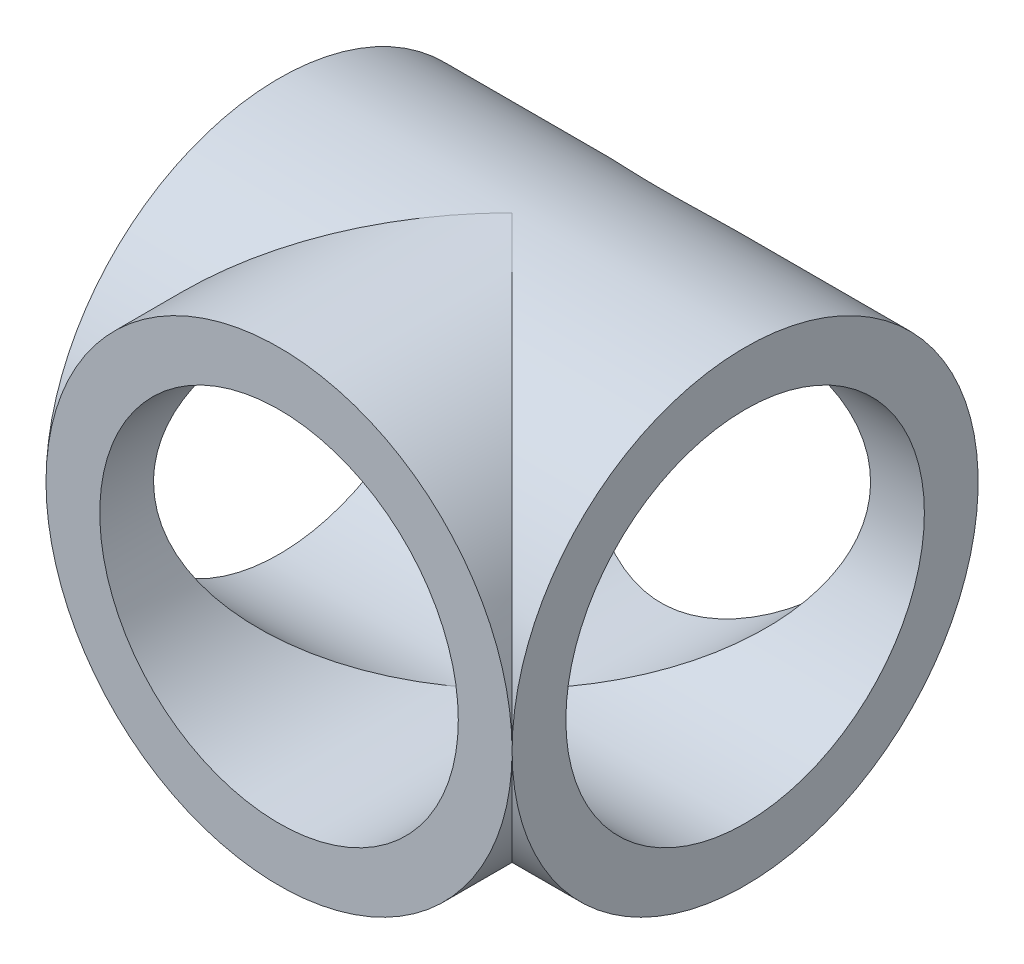
ISO-10303-21;
HEADER;
FILE_DESCRIPTION(('STEP AP214'),'2;1');
FILE_NAME('part.step','',(''),(''),'','','');
FILE_SCHEMA(('AUTOMOTIVE_DESIGN { 1 0 10303 214 1 1 1 1 }'));
ENDSEC;
DATA;
#1=APPLICATION_CONTEXT('core data for automotive mechanical design processes');
#2=APPLICATION_PROTOCOL_DEFINITION('international standard','automotive_design',2000,#1);
#3=PRODUCT_CONTEXT('',#1,'mechanical');
#4=PRODUCT('Part','Part','',(#3));
#5=PRODUCT_RELATED_PRODUCT_CATEGORY('part','',(#4));
#6=PRODUCT_DEFINITION_FORMATION('','',#4);
#7=PRODUCT_DEFINITION_CONTEXT('part definition',#1,'design');
#8=PRODUCT_DEFINITION('design','',#6,#7);
#9=PRODUCT_DEFINITION_SHAPE('','',#8);
#10=(LENGTH_UNIT() NAMED_UNIT(*) SI_UNIT(.MILLI.,.METRE.));
#11=(NAMED_UNIT(*) PLANE_ANGLE_UNIT() SI_UNIT($,.RADIAN.));
#12=(NAMED_UNIT(*) SI_UNIT($,.STERADIAN.) SOLID_ANGLE_UNIT());
#13=UNCERTAINTY_MEASURE_WITH_UNIT(LENGTH_MEASURE(1.E-05),#10,'distance_accuracy_value','');
#14=(GEOMETRIC_REPRESENTATION_CONTEXT(3) GLOBAL_UNCERTAINTY_ASSIGNED_CONTEXT((#13)) GLOBAL_UNIT_ASSIGNED_CONTEXT((#10,
#11,#12)) REPRESENTATION_CONTEXT('',''));
#15=CARTESIAN_POINT('',(0.,0.,0.));
#16=DIRECTION('',(0.,0.,1.));
#17=DIRECTION('',(1.,0.,0.));
#18=AXIS2_PLACEMENT_3D('',#15,#16,#17);
#19=CARTESIAN_POINT('',(0.,0.,-20.));
#20=DIRECTION('',(0.,0.,1.));
#21=DIRECTION('',(1.,0.,0.));
#22=AXIS2_PLACEMENT_3D('',#19,#20,#21);
#23=CYLINDRICAL_SURFACE('',#22,10.);
#24=CARTESIAN_POINT('',(0.,0.,13.));
#25=DIRECTION('',(0.,0.,1.));
#26=DIRECTION('',(1.,0.,0.));
#27=AXIS2_PLACEMENT_3D('',#24,#25,#26);
#28=CIRCLE('',#27,10.);
#29=CARTESIAN_POINT('',(10.,0.,13.));
#30=VERTEX_POINT('',#29);
#31=EDGE_CURVE('E121',#30,#30,#28,.T.);
#32=ORIENTED_EDGE('',*,*,#31,.T.);
#33=EDGE_LOOP('',(#32));
#34=FACE_BOUND('',#33,.T.);
#35=CARTESIAN_POINT('',(0.,0.,0.));
#36=DIRECTION('',(0.707106781186547,0.,0.707106781186547));
#37=DIRECTION('',(-0.707106781186547,0.,0.707106781186547));
#38=AXIS2_PLACEMENT_3D('',#35,#36,#37);
#39=ELLIPSE('',#38,14.1421356237309,10.);
#40=CARTESIAN_POINT('',(0.,-10.,0.));
#41=VERTEX_POINT('',#40);
#42=CARTESIAN_POINT('',(0.,10.,0.));
#43=VERTEX_POINT('',#42);
#44=EDGE_CURVE('E54',#41,#43,#39,.F.);
#45=ORIENTED_EDGE('',*,*,#44,.T.);
#46=CARTESIAN_POINT('',(0.,0.,0.));
#47=DIRECTION('',(-0.707106781186547,0.,0.707106781186547));
#48=DIRECTION('',(0.707106781186547,0.,0.707106781186547));
#49=AXIS2_PLACEMENT_3D('',#46,#47,#48);
#50=ELLIPSE('',#49,14.1421356237309,10.);
#51=EDGE_CURVE('E11',#43,#41,#50,.F.);
#52=ORIENTED_EDGE('',*,*,#51,.T.);
#53=EDGE_LOOP('',(#45,#52));
#54=FACE_BOUND('',#53,.T.);
#55=ADVANCED_FACE('F39',(#34,#54),#23,.F.);
#56=CARTESIAN_POINT('',(-13.,0.,0.));
#57=DIRECTION('',(1.,0.,0.));
#58=DIRECTION('',(0.,0.,-1.));
#59=AXIS2_PLACEMENT_3D('',#56,#57,#58);
#60=CYLINDRICAL_SURFACE('',#59,13.);
#61=CARTESIAN_POINT('',(-10.,0.,-13.));
#62=CARTESIAN_POINT('',(-10.0000015936708,0.242807032138664,-13.0000015508397));
#63=CARTESIAN_POINT('',(-9.99114466176018,0.48559485000438,-12.9931846000855));
#64=CARTESIAN_POINT('',(-9.95587278049876,0.969223062587691,-12.9660816615135));
#65=CARTESIAN_POINT('',(-9.92945165614769,1.21006274225187,-12.9457909367568));
#66=CARTESIAN_POINT('',(-9.85945280094943,1.68808503221816,-12.8921799513601));
#67=CARTESIAN_POINT('',(-9.81585190164868,1.92526225263056,-12.8588420959167));
#68=CARTESIAN_POINT('',(-9.71220619186371,2.39387505659068,-12.7798991544544));
#69=CARTESIAN_POINT('',(-9.65216255209941,2.62531104763386,-12.7342949418019));
#70=CARTESIAN_POINT('',(-9.5169161703633,3.07963617362338,-12.6320918522629));
#71=CARTESIAN_POINT('',(-9.44180514331292,3.30256774690942,-12.5755595666376));
#72=CARTESIAN_POINT('',(-9.27717128501848,3.7401534229174,-12.4524263396324));
#73=CARTESIAN_POINT('',(-9.18764823451349,3.95480739964445,-12.385825245069));
#74=CARTESIAN_POINT('',(-8.99522033964302,4.3748558839517,-12.2437648775377));
#75=CARTESIAN_POINT('',(-8.89232067713747,4.58025393583328,-12.1683090358357));
#76=CARTESIAN_POINT('',(-8.67403389583575,4.98129337775095,-12.009714311468));
#77=CARTESIAN_POINT('',(-8.55864212335768,5.17693109184884,-11.9265725672721));
#78=CARTESIAN_POINT('',(-8.30496045482638,5.57571292090348,-11.7457958769228));
#79=CARTESIAN_POINT('',(-8.16553849802746,5.77785141030143,-11.6475325600616));
#80=CARTESIAN_POINT('',(-7.87385887646458,6.16943831864769,-11.4449395496011));
#81=CARTESIAN_POINT('',(-7.72159948538149,6.35888502469641,-11.3406090407008));
#82=CARTESIAN_POINT('',(-7.4048683475056,6.72507351489174,-11.1273688169516));
#83=CARTESIAN_POINT('',(-7.24037954081195,6.90179684752463,-11.018452800778));
#84=CARTESIAN_POINT('',(-6.90008419180774,7.24201046972777,-10.7978877395886));
#85=CARTESIAN_POINT('',(-6.72428062018934,7.40550420748832,-10.6862394166726));
#86=CARTESIAN_POINT('',(-6.32302708914024,7.75267471913366,-10.4379480570597));
#87=CARTESIAN_POINT('',(-6.09499376889194,7.93320304467126,-10.3010601681606));
#88=CARTESIAN_POINT('',(-5.62327116239582,8.27427260789736,-10.0291570710896));
#89=CARTESIAN_POINT('',(-5.37957701322961,8.43480759145202,-9.89414246057659));
#90=CARTESIAN_POINT('',(-4.87688279716864,8.73507977812582,-9.63007244778975));
#91=CARTESIAN_POINT('',(-4.61789558351795,8.87483410856925,-9.50101219915607));
#92=CARTESIAN_POINT('',(-4.08466204071591,9.13253912364104,-9.2535741549753));
#93=CARTESIAN_POINT('',(-3.81042456262883,9.25050228725785,-9.13519026548099));
#94=CARTESIAN_POINT('',(-3.1646441521692,9.49398709572563,-8.88274716970649));
#95=CARTESIAN_POINT('',(-2.7879064811507,9.61181901858345,-8.75406424027543));
#96=CARTESIAN_POINT('',(-2.2064176820189,9.75559210219195,-8.59265063451949));
#97=CARTESIAN_POINT('',(-2.00998036640735,9.79800509685261,-8.54413419743265));
#98=CARTESIAN_POINT('',(-1.61237836927584,9.87122257600602,-8.45943845030322));
#99=CARTESIAN_POINT('',(-1.41121625980722,9.90203322772709,-8.42325258691669));
#100=CARTESIAN_POINT('',(-1.00310660306036,9.95170823805676,-8.36450933572807));
#101=CARTESIAN_POINT('',(-0.796119575692899,9.97043574512663,-8.34210819837131));
#102=CARTESIAN_POINT('',(-0.380278611393944,9.99493646044255,-8.31273832620987));
#103=CARTESIAN_POINT('',(-0.171424758097213,10.0007102461305,-8.30576890350122));
#104=CARTESIAN_POINT('',(0.246178019587992,9.99915005215022,-8.3076470019975));
#105=CARTESIAN_POINT('',(0.454926933167803,9.99181492288274,-8.31649591040661));
#106=CARTESIAN_POINT('',(0.870330026174368,9.96422912377529,-8.34952659288942));
#107=CARTESIAN_POINT('',(1.07698420251023,9.94397843488054,-8.37370838958428));
#108=CARTESIAN_POINT('',(1.46077611302282,9.89437934343394,-8.43223083391789));
#109=CARTESIAN_POINT('',(1.63836215893885,9.86649238457407,-8.46491484418373));
#110=CARTESIAN_POINT('',(1.98983471837062,9.80165921740072,-8.53990249014137));
#111=CARTESIAN_POINT('',(2.16371989826362,9.76470980151033,-8.58220953143449));
#112=CARTESIAN_POINT('',(2.67905495836881,9.64092546187557,-8.72169630381142));
#113=CARTESIAN_POINT('',(3.01410873404257,9.54116452600475,-8.83142919974863));
#114=CARTESIAN_POINT('',(3.60817855511688,9.33073948619979,-9.05297946378067));
#115=CARTESIAN_POINT('',(3.87035235782311,9.2249118432684,-9.16118334144466));
#116=CARTESIAN_POINT('',(4.38114894756183,8.99356027077872,-9.3884062458422));
#117=CARTESIAN_POINT('',(4.62976412243357,8.86802542739885,-9.50743124983691));
#118=CARTESIAN_POINT('',(5.11375085679115,8.59805359213383,-9.75226978340447));
#119=CARTESIAN_POINT('',(5.34909294899211,8.4535767407365,-9.87809728980088));
#120=CARTESIAN_POINT('',(5.80590711636373,8.14660318454038,-10.1327504299295));
#121=CARTESIAN_POINT('',(6.02738151411002,7.98410950991666,-10.2615755566333));
#122=CARTESIAN_POINT('',(6.46327400097469,7.63586505952988,-10.5234297143361));
#123=CARTESIAN_POINT('',(6.67722343014561,7.44952688621407,-10.6564582461348));
#124=CARTESIAN_POINT('',(7.08950694010948,7.05830323794465,-10.9195206446139));
#125=CARTESIAN_POINT('',(7.28783944253884,6.85341589275996,-11.049554207663));
#126=CARTESIAN_POINT('',(7.66757098527356,6.42572937938231,-11.3036178485803));
#127=CARTESIAN_POINT('',(7.84899641994254,6.20295917658503,-11.4276571335013));
#128=CARTESIAN_POINT('',(8.19388188709714,5.73965593248316,-11.6672328720954));
#129=CARTESIAN_POINT('',(8.35734591341937,5.49912685994802,-11.7827712141133));
#130=CARTESIAN_POINT('',(8.63668064285031,5.04629346721088,-11.9826774715815));
#131=CARTESIAN_POINT('',(8.75580152484482,4.83680566231991,-12.0688938526394));
#132=CARTESIAN_POINT('',(8.97980355638798,4.40701997489678,-12.2323754063567));
#133=CARTESIAN_POINT('',(9.08468758194032,4.18672428795553,-12.3096423864307));
#134=CARTESIAN_POINT('',(9.27905407965338,3.73621659254942,-12.4537783751208));
#135=CARTESIAN_POINT('',(9.36854109597122,3.5060075350063,-12.5206504510458));
#136=CARTESIAN_POINT('',(9.53098147282556,3.03677831442462,-12.6426552405453));
#137=CARTESIAN_POINT('',(9.60393468191351,2.79775807069953,-12.6977878465867));
#138=CARTESIAN_POINT('',(9.73266267918379,2.31066689524092,-12.7954268857977));
#139=CARTESIAN_POINT('',(9.78830935378846,2.06254299060328,-12.8378390760887));
#140=CARTESIAN_POINT('',(9.88073791771212,1.56079517074882,-12.9084503763464));
#141=CARTESIAN_POINT('',(9.91751972641411,1.30717123203301,-12.9366494255748));
#142=CARTESIAN_POINT('',(9.97150949956756,0.796757596519581,-12.9780854483897));
#143=CARTESIAN_POINT('',(9.98872732558396,0.539969560685166,-12.9913299600491));
#144=CARTESIAN_POINT('',(10.0032768827642,0.0255105335601476,-13.0025199330903));
#145=CARTESIAN_POINT('',(10.0006106704895,-0.232160363662756,-13.0004669766549));
#146=CARTESIAN_POINT('',(9.97692220479573,-0.716031577612342,-12.9822545351876));
#147=CARTESIAN_POINT('',(9.95807124720882,-0.94240610722969,-12.9677637343962));
#148=CARTESIAN_POINT('',(9.90518951571755,-1.3923041243846,-12.9271996395152));
#149=CARTESIAN_POINT('',(9.87116013963562,-1.61582787250918,-12.901127411992));
#150=CARTESIAN_POINT('',(9.78841442983994,-2.05856020658568,-12.8379260332623));
#151=CARTESIAN_POINT('',(9.73969658924814,-2.27776834734368,-12.8007957476231));
#152=CARTESIAN_POINT('',(9.6282347664812,-2.71054148672981,-12.7161939847182));
#153=CARTESIAN_POINT('',(9.56549014748951,-2.92410622865492,-12.668722037943));
#154=CARTESIAN_POINT('',(9.42556955745235,-3.34802777701546,-12.5634072426999));
#155=CARTESIAN_POINT('',(9.34816851459013,-3.55827013187015,-12.5054033236095));
#156=CARTESIAN_POINT('',(9.18050336248252,-3.97089439697922,-12.3805702666688));
#157=CARTESIAN_POINT('',(9.09023469809512,-4.17327349121307,-12.3137380041991));
#158=CARTESIAN_POINT('',(8.80149941319451,-4.76731436996982,-12.1016220064741));
#159=CARTESIAN_POINT('',(8.58499896256089,-5.14619127582007,-11.9446392676165));
#160=CARTESIAN_POINT('',(8.07217991410438,-5.923736407294,-11.5811085980081));
#161=CARTESIAN_POINT('',(7.76862258126021,-6.31577096091044,-11.3706498133092));
#162=CARTESIAN_POINT('',(7.27682958572621,-6.86353830721924,-11.0425280951877));
#163=CARTESIAN_POINT('',(7.10658804567629,-7.03960702826518,-10.9309354603759));
#164=CARTESIAN_POINT('',(6.75451428855746,-7.37808495382674,-10.705380259583));
#165=CARTESIAN_POINT('',(6.57268455359917,-7.54049706632198,-10.591418204615));
#166=CARTESIAN_POINT('',(6.15911939067563,-7.88363053302019,-10.3393695004614));
#167=CARTESIAN_POINT('',(5.92483551980561,-8.06120044507073,-10.2011638654771));
#168=CARTESIAN_POINT('',(5.44032676524378,-8.39580676350278,-9.92759451060697));
#169=CARTESIAN_POINT('',(5.19009647019613,-8.55283614375974,-9.79223177638957));
#170=CARTESIAN_POINT('',(4.67412936965358,-8.84535482112134,-9.52881765859009));
#171=CARTESIAN_POINT('',(4.40841356715257,-8.98087240608728,-9.40075681756572));
#172=CARTESIAN_POINT('',(3.86144009702023,-9.22927642048465,-9.1570038169378));
#173=CARTESIAN_POINT('',(3.58019302571493,-9.34217804231815,-9.04130337871063));
#174=CARTESIAN_POINT('',(2.93012675144208,-9.56870128636216,-8.80190215702689));
#175=CARTESIAN_POINT('',(2.55689045032102,-9.67555440549424,-8.68333615256315));
#176=CARTESIAN_POINT('',(1.98220932853729,-9.8035387149146,-8.53784543233316));
#177=CARTESIAN_POINT('',(1.7883074930073,-9.84080396181053,-8.49475893048836));
#178=CARTESIAN_POINT('',(1.39638073596852,-9.90401209057724,-8.42098045894134));
#179=CARTESIAN_POINT('',(1.19835797794424,-9.92996076399724,-8.39028214986315));
#180=CARTESIAN_POINT('',(0.797547132049902,-9.97019919650453,-8.34242934221352));
#181=CARTESIAN_POINT('',(0.594731574776318,-9.98437498966765,-8.32540728522932));
#182=CARTESIAN_POINT('',(0.187909380505777,-10.0003059719137,-8.30626511806214));
#183=CARTESIAN_POINT('',(-0.0160971935490929,-10.002061811517,-8.30414422740031));
#184=CARTESIAN_POINT('',(-0.423537147355513,-9.99310564610198,-8.31491947483524));
#185=CARTESIAN_POINT('',(-0.626970182535196,-9.98238729510685,-8.32782325641322));
#186=CARTESIAN_POINT('',(-1.03138551948346,-9.94874052975143,-8.36798890299469));
#187=CARTESIAN_POINT('',(-1.23236752838823,-9.9258106706264,-8.3952524669248));
#188=CARTESIAN_POINT('',(-1.65166680769234,-9.86516720538123,-8.46645607386093));
#189=CARTESIAN_POINT('',(-1.86954307905686,-9.82613625557957,-8.5118661713926));
#190=CARTESIAN_POINT('',(-2.29901893626497,-9.73461758322383,-8.6163826960854));
#191=CARTESIAN_POINT('',(-2.51061756193177,-9.68212781383845,-8.67549120638379));
#192=CARTESIAN_POINT('',(-3.1356470574672,-9.50554300847556,-8.86990097887381));
#193=CARTESIAN_POINT('',(-3.53860152480577,-9.36243973270114,-9.02215149753559));
#194=CARTESIAN_POINT('',(-4.20159818596448,-9.07946451198734,-9.30543935232299));
#195=CARTESIAN_POINT('',(-4.46939391170317,-8.95051599663797,-9.4299708330095));
#196=CARTESIAN_POINT('',(-4.98961658252654,-8.67126372093179,-9.68737416049814));
#197=CARTESIAN_POINT('',(-5.24203730984345,-8.52095140173104,-9.82024933801508));
#198=CARTESIAN_POINT('',(-5.73152106992433,-8.199724920127,-10.0900239766246));
#199=CARTESIAN_POINT('',(-5.96856732373444,-8.02878881285196,-10.2269276050312));
#200=CARTESIAN_POINT('',(-6.42673388391388,-7.66695927323922,-10.5009157952784));
#201=CARTESIAN_POINT('',(-6.6478564228612,-7.47606864785334,-10.6380003290001));
#202=CARTESIAN_POINT('',(-7.07826700179556,-7.07018782840658,-10.9120913549685));
#203=CARTESIAN_POINT('',(-7.28718498292483,-6.85475789152892,-11.0490290218835));
#204=CARTESIAN_POINT('',(-7.68661277108212,-6.40365003770765,-11.3164492691485));
#205=CARTESIAN_POINT('',(-7.87712018981195,-6.16796950123971,-11.4469310109393));
#206=CARTESIAN_POINT('',(-8.23775928125776,-5.6773105697013,-11.6980325953962));
#207=CARTESIAN_POINT('',(-8.40792651555258,-5.42236716560417,-11.8186695293759));
#208=CARTESIAN_POINT('',(-8.72620374314896,-4.89371641037956,-12.0471725826831));
#209=CARTESIAN_POINT('',(-8.87432286455657,-4.62001689336502,-12.155043983237));
#210=CARTESIAN_POINT('',(-9.1103878531224,-4.12966713759212,-12.3286080865661));
#211=CARTESIAN_POINT('',(-9.20390944923678,-3.91696689980968,-12.3979286664437));
#212=CARTESIAN_POINT('',(-9.37673434343713,-3.48301122598925,-12.5267643858758));
#213=CARTESIAN_POINT('',(-9.45604092394343,-3.26175777937353,-12.5862817888453));
#214=CARTESIAN_POINT('',(-9.59934080932169,-2.81215588440016,-12.6942952020841));
#215=CARTESIAN_POINT('',(-9.66336068527016,-2.58382053811232,-12.7428103288243));
#216=CARTESIAN_POINT('',(-9.77534553528752,-2.12114497458197,-12.8279405308735));
#217=CARTESIAN_POINT('',(-9.82331575240815,-1.88680674532656,-12.8645594922706));
#218=CARTESIAN_POINT('',(-9.90824542695849,-1.37918529322392,-12.9295190963754));
#219=CARTESIAN_POINT('',(-9.94258357786757,-1.10520090982991,-12.9558772058697));
#220=CARTESIAN_POINT('',(-9.98846254263325,-0.554136470857206,-12.9911187562463));
#221=CARTESIAN_POINT('',(-9.99999818153696,-0.277055726915079,-12.9999982304094));
#222=CARTESIAN_POINT('',(-10.,0.,-13.));
#223=B_SPLINE_CURVE_WITH_KNOTS('',3,(#61,#62,#63,#64,#65,#66,#67,#68,#69,#70,#71,#72,#73,#74,
#75,#76,#77,#78,#79,#80,#81,#82,#83,#84,#85,#86,#87,#88,#89,#90,#91,#92,#93,#94,#95,#96,#97,#98,
#99,#100,#101,#102,#103,#104,#105,#106,#107,#108,#109,#110,#111,#112,#113,#114,#115,#116,#117,
#118,#119,#120,#121,#122,#123,#124,#125,#126,#127,#128,#129,#130,#131,#132,#133,#134,#135,#136,
#137,#138,#139,#140,#141,#142,#143,#144,#145,#146,#147,#148,#149,#150,#151,#152,#153,#154,#155,
#156,#157,#158,#159,#160,#161,#162,#163,#164,#165,#166,#167,#168,#169,#170,#171,#172,#173,#174,
#175,#176,#177,#178,#179,#180,#181,#182,#183,#184,#185,#186,#187,#188,#189,#190,#191,#192,#193,
#194,#195,#196,#197,#198,#199,#200,#201,#202,#203,#204,#205,#206,#207,#208,#209,#210,#211,#212,
#213,#214,#215,#216,#217,#218,#219,#220,#221,#222),.UNSPECIFIED.,.T.,.F.,(4,2,2,2,2,2,2,2,2,2,2,
2,2,2,2,2,2,2,2,2,2,2,2,2,2,2,2,2,2,2,2,2,2,2,2,2,2,2,2,2,2,2,2,2,2,2,2,2,2,2,2,2,2,2,2,2,2,2,2,
2,2,2,2,2,2,2,2,2,2,2,2,2,2,2,2,2,2,2,2,2,4),(0.,0.728133411934144,1.45652294742847,
2.18589816158533,2.91522145786528,3.64023319339417,4.36525596011322,5.08999869831325,
5.81501235986334,6.60774394675107,7.40058230708559,8.19454820554974,8.98830649194407,
9.95161393968537,10.9152219675836,11.8780313385226,12.8402876235282,14.0809805116184,
14.7005844753305,15.3198586219352,15.9460288473121,16.5721711591574,17.1983683838652,
17.8245665324257,18.37214470283,18.9199169641048,20.0156912713173,20.9227553184134,
21.8303234800677,22.7398330376889,23.6491898600234,24.5883289915073,25.5275629179206,
26.4653051006527,27.4028383465119,28.1699598487427,28.9369261525169,29.7036657099196,
30.4704122903197,31.2427066585885,32.0150043271477,32.7869125327299,33.558740902683,
34.2407883109784,34.9227729206116,35.6048275183312,36.2869130876602,36.9804761919562,
37.6742854303574,39.0608994616169,40.6707475825318,41.4776801338984,42.2844404230779,
43.2579072139869,44.2317061244383,45.2042136940001,46.1760657689562,47.3889927393499,
47.9946765122454,48.6000499460062,49.2112174812015,49.8223530050169,50.4337995668702,
51.0453184861052,51.7221465730301,52.3990776537899,53.7551044333448,54.7208610809266,
55.6870057297371,56.6541876307483,57.6212336633312,58.6096745887615,59.5982435674042,
60.5850580946944,61.5714629292426,62.2981888389914,63.0247467220783,63.7500323692151,
64.4750808504634,65.3057312762582,66.1365701937215),.UNSPECIFIED.);
#224=CARTESIAN_POINT('',(-10.,0.,-13.));
#225=VERTEX_POINT('',#224);
#226=EDGE_CURVE('E113',#225,#225,#223,.T.);
#227=ORIENTED_EDGE('',*,*,#226,.F.);
#228=EDGE_LOOP('',(#227));
#229=FACE_BOUND('',#228,.T.);
#230=CARTESIAN_POINT('',(0.,0.,0.));
#231=DIRECTION('',(0.707106781186547,0.,-0.707106781186547));
#232=DIRECTION('',(0.707106781186547,0.,0.707106781186547));
#233=AXIS2_PLACEMENT_3D('',#230,#231,#232);
#234=ELLIPSE('',#233,18.3847763108502,13.);
#235=CARTESIAN_POINT('',(13.,0.,13.));
#236=VERTEX_POINT('',#235);
#237=CARTESIAN_POINT('',(0.,-13.,0.));
#238=VERTEX_POINT('',#237);
#239=EDGE_CURVE('E104',#236,#238,#234,.T.);
#240=ORIENTED_EDGE('',*,*,#239,.T.);
#241=CARTESIAN_POINT('',(0.,0.,0.));
#242=DIRECTION('',(0.707106781186547,0.,0.707106781186547));
#243=DIRECTION('',(0.707106781186547,0.,-0.707106781186547));
#244=AXIS2_PLACEMENT_3D('',#241,#242,#243);
#245=ELLIPSE('',#244,18.3847763108502,13.);
#246=CARTESIAN_POINT('',(-13.,0.,13.));
#247=VERTEX_POINT('',#246);
#248=EDGE_CURVE('E99',#238,#247,#245,.F.);
#249=ORIENTED_EDGE('',*,*,#248,.T.);
#250=CARTESIAN_POINT('',(-13.,0.,0.));
#251=DIRECTION('',(1.,0.,0.));
#252=DIRECTION('',(0.,0.,-1.));
#253=AXIS2_PLACEMENT_3D('',#250,#251,#252);
#254=CIRCLE('',#253,13.);
#255=EDGE_CURVE('E86',#247,#247,#254,.T.);
#256=ORIENTED_EDGE('',*,*,#255,.T.);
#257=CARTESIAN_POINT('',(0.,13.,0.));
#258=VERTEX_POINT('',#257);
#259=EDGE_CURVE('E103',#247,#258,#245,.F.);
#260=ORIENTED_EDGE('',*,*,#259,.T.);
#261=EDGE_CURVE('E62',#258,#236,#234,.T.);
#262=ORIENTED_EDGE('',*,*,#261,.T.);
#263=CARTESIAN_POINT('',(13.,0.,0.));
#264=DIRECTION('',(1.,0.,0.));
#265=DIRECTION('',(0.,0.,-1.));
#266=AXIS2_PLACEMENT_3D('',#263,#264,#265);
#267=CIRCLE('',#266,13.);
#268=EDGE_CURVE('E95',#236,#236,#267,.T.);
#269=ORIENTED_EDGE('',*,*,#268,.F.);
#270=EDGE_LOOP('',(#240,#249,#256,#260,#262,#269));
#271=FACE_BOUND('',#270,.T.);
#272=ADVANCED_FACE('F41',(#229,#271),#60,.T.);
#273=CARTESIAN_POINT('',(-13.,0.,0.));
#274=DIRECTION('',(1.,0.,0.));
#275=DIRECTION('',(0.,0.,-1.));
#276=AXIS2_PLACEMENT_3D('',#273,#274,#275);
#277=PLANE('',#276);
#278=CARTESIAN_POINT('',(-13.,0.,0.));
#279=DIRECTION('',(-1.,0.,0.));
#280=DIRECTION('',(0.,0.,1.));
#281=AXIS2_PLACEMENT_3D('',#278,#279,#280);
#282=CIRCLE('',#281,10.);
#283=CARTESIAN_POINT('',(-13.,0.,10.));
#284=VERTEX_POINT('',#283);
#285=EDGE_CURVE('E158',#284,#284,#282,.T.);
#286=ORIENTED_EDGE('',*,*,#285,.F.);
#287=EDGE_LOOP('',(#286));
#288=FACE_BOUND('',#287,.T.);
#289=ORIENTED_EDGE('',*,*,#255,.F.);
#290=EDGE_LOOP('',(#289));
#291=FACE_BOUND('',#290,.T.);
#292=ADVANCED_FACE('F138',(#288,#291),#277,.F.);
#293=CARTESIAN_POINT('',(13.,0.,0.));
#294=DIRECTION('',(1.,0.,0.));
#295=DIRECTION('',(0.,0.,-1.));
#296=AXIS2_PLACEMENT_3D('',#293,#294,#295);
#297=PLANE('',#296);
#298=CARTESIAN_POINT('',(13.,0.,0.));
#299=DIRECTION('',(1.,0.,0.));
#300=DIRECTION('',(0.,0.,-1.));
#301=AXIS2_PLACEMENT_3D('',#298,#299,#300);
#302=CIRCLE('',#301,10.);
#303=CARTESIAN_POINT('',(13.,0.,-10.));
#304=VERTEX_POINT('',#303);
#305=EDGE_CURVE('E155',#304,#304,#302,.T.);
#306=ORIENTED_EDGE('',*,*,#305,.F.);
#307=EDGE_LOOP('',(#306));
#308=FACE_BOUND('',#307,.T.);
#309=ORIENTED_EDGE('',*,*,#268,.T.);
#310=EDGE_LOOP('',(#309));
#311=FACE_BOUND('',#310,.T.);
#312=ADVANCED_FACE('F136',(#308,#311),#297,.T.);
#313=CARTESIAN_POINT('',(0.,0.,13.));
#314=DIRECTION('',(0.,0.,-1.));
#315=DIRECTION('',(-1.,0.,0.));
#316=AXIS2_PLACEMENT_3D('',#313,#314,#315);
#317=CYLINDRICAL_SURFACE('',#316,13.);
#318=ORIENTED_EDGE('',*,*,#261,.F.);
#319=ORIENTED_EDGE('',*,*,#259,.F.);
#320=CARTESIAN_POINT('',(0.,0.,13.));
#321=DIRECTION('',(0.,0.,1.));
#322=DIRECTION('',(1.,0.,0.));
#323=AXIS2_PLACEMENT_3D('',#320,#321,#322);
#324=CIRCLE('',#323,13.);
#325=EDGE_CURVE('E108',#236,#247,#324,.T.);
#326=ORIENTED_EDGE('',*,*,#325,.F.);
#327=EDGE_LOOP('',(#318,#319,#326));
#328=FACE_BOUND('',#327,.T.);
#329=ADVANCED_FACE('F131',(#328),#317,.T.);
#330=CARTESIAN_POINT('',(0.,0.,13.));
#331=DIRECTION('',(0.,0.,1.));
#332=DIRECTION('',(1.,0.,0.));
#333=AXIS2_PLACEMENT_3D('',#330,#331,#332);
#334=PLANE('',#333);
#335=ORIENTED_EDGE('',*,*,#31,.F.);
#336=EDGE_LOOP('',(#335));
#337=FACE_BOUND('',#336,.T.);
#338=ORIENTED_EDGE('',*,*,#325,.T.);
#339=EDGE_CURVE('E112',#247,#236,#324,.T.);
#340=ORIENTED_EDGE('',*,*,#339,.T.);
#341=EDGE_LOOP('',(#338,#340));
#342=FACE_BOUND('',#341,.T.);
#343=ADVANCED_FACE('F128',(#337,#342),#334,.T.);
#344=ORIENTED_EDGE('',*,*,#248,.F.);
#345=ORIENTED_EDGE('',*,*,#239,.F.);
#346=ORIENTED_EDGE('',*,*,#339,.F.);
#347=EDGE_LOOP('',(#344,#345,#346));
#348=FACE_BOUND('',#347,.T.);
#349=ADVANCED_FACE('F127',(#348),#317,.T.);
#350=CARTESIAN_POINT('',(0.,0.,0.));
#351=DIRECTION('',(0.707106781186547,0.,0.707106781186547));
#352=DIRECTION('',(-0.707106781186547,0.,0.707106781186547));
#353=AXIS2_PLACEMENT_3D('',#350,#351,#352);
#354=ELLIPSE('',#353,14.1421356237309,10.);
#355=EDGE_CURVE('E77',#41,#43,#354,.T.);
#356=ORIENTED_EDGE('',*,*,#355,.T.);
#357=CARTESIAN_POINT('',(0.,0.,0.));
#358=DIRECTION('',(-0.707106781186547,0.,0.707106781186547));
#359=DIRECTION('',(0.707106781186547,0.,0.707106781186547));
#360=AXIS2_PLACEMENT_3D('',#357,#358,#359);
#361=ELLIPSE('',#360,14.1421356237309,10.);
#362=EDGE_CURVE('E49',#43,#41,#361,.T.);
#363=ORIENTED_EDGE('',*,*,#362,.T.);
#364=EDGE_LOOP('',(#356,#363));
#365=FACE_BOUND('',#364,.T.);
#366=ORIENTED_EDGE('',*,*,#226,.T.);
#367=EDGE_LOOP('',(#366));
#368=FACE_BOUND('',#367,.T.);
#369=ADVANCED_FACE('F88',(#365,#368),#23,.F.);
#370=CARTESIAN_POINT('',(20.,0.,0.));
#371=DIRECTION('',(-1.,0.,0.));
#372=DIRECTION('',(0.,0.,1.));
#373=AXIS2_PLACEMENT_3D('',#370,#371,#372);
#374=CYLINDRICAL_SURFACE('',#373,10.);
#375=ORIENTED_EDGE('',*,*,#285,.T.);
#376=EDGE_LOOP('',(#375));
#377=FACE_BOUND('',#376,.T.);
#378=ORIENTED_EDGE('',*,*,#44,.F.);
#379=ORIENTED_EDGE('',*,*,#362,.F.);
#380=EDGE_LOOP('',(#378,#379));
#381=FACE_BOUND('',#380,.T.);
#382=ADVANCED_FACE('F84',(#377,#381),#374,.F.);
#383=ORIENTED_EDGE('',*,*,#305,.T.);
#384=EDGE_LOOP('',(#383));
#385=FACE_BOUND('',#384,.T.);
#386=ORIENTED_EDGE('',*,*,#355,.F.);
#387=ORIENTED_EDGE('',*,*,#51,.F.);
#388=EDGE_LOOP('',(#386,#387));
#389=FACE_BOUND('',#388,.T.);
#390=ADVANCED_FACE('F78',(#385,#389),#374,.F.);
#391=CLOSED_SHELL('',(#55,#272,#292,#312,#329,#343,#349,#369,#382,#390));
#392=MANIFOLD_SOLID_BREP('B2',#391);
#393=ADVANCED_BREP_SHAPE_REPRESENTATION('',(#18,#392),#14);
#394=SHAPE_DEFINITION_REPRESENTATION(#9,#393);
ENDSEC;
END-ISO-10303-21;
